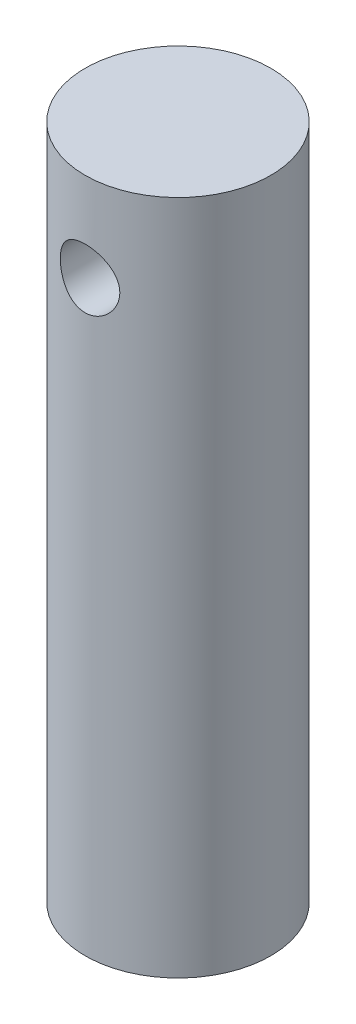
ISO-10303-21;
HEADER;
FILE_DESCRIPTION(('STEP AP214'),'2;1');
FILE_NAME('part.step','',(''),(''),'','','');
FILE_SCHEMA(('AUTOMOTIVE_DESIGN { 1 0 10303 214 1 1 1 1 }'));
ENDSEC;
DATA;
#1=APPLICATION_CONTEXT('core data for automotive mechanical design processes');
#2=APPLICATION_PROTOCOL_DEFINITION('international standard','automotive_design',2000,#1);
#3=PRODUCT_CONTEXT('',#1,'mechanical');
#4=PRODUCT('Part','Part','',(#3));
#5=PRODUCT_RELATED_PRODUCT_CATEGORY('part','',(#4));
#6=PRODUCT_DEFINITION_FORMATION('','',#4);
#7=PRODUCT_DEFINITION_CONTEXT('part definition',#1,'design');
#8=PRODUCT_DEFINITION('design','',#6,#7);
#9=PRODUCT_DEFINITION_SHAPE('','',#8);
#10=(LENGTH_UNIT() NAMED_UNIT(*) SI_UNIT(.MILLI.,.METRE.));
#11=(NAMED_UNIT(*) PLANE_ANGLE_UNIT() SI_UNIT($,.RADIAN.));
#12=(NAMED_UNIT(*) SI_UNIT($,.STERADIAN.) SOLID_ANGLE_UNIT());
#13=UNCERTAINTY_MEASURE_WITH_UNIT(LENGTH_MEASURE(1.E-05),#10,'distance_accuracy_value','');
#14=(GEOMETRIC_REPRESENTATION_CONTEXT(3) GLOBAL_UNCERTAINTY_ASSIGNED_CONTEXT((#13)) GLOBAL_UNIT_ASSIGNED_CONTEXT((#10,
#11,#12)) REPRESENTATION_CONTEXT('',''));
#15=CARTESIAN_POINT('',(0.,0.,0.));
#16=DIRECTION('',(0.,0.,1.));
#17=DIRECTION('',(1.,0.,0.));
#18=AXIS2_PLACEMENT_3D('',#15,#16,#17);
#19=CARTESIAN_POINT('',(20.574,290.957,-19.939));
#20=DIRECTION('',(0.,-1.,0.));
#21=DIRECTION('',(0.,0.,-1.));
#22=AXIS2_PLACEMENT_3D('',#19,#20,#21);
#23=CYLINDRICAL_SURFACE('',#22,9.906);
#24=CARTESIAN_POINT('',(20.574,284.607,-29.845));
#25=CARTESIAN_POINT('',(20.4003900975091,284.606999562888,-29.8449996061915));
#26=CARTESIAN_POINT('',(20.2267746019822,284.59271373406,-29.8403933308697));
#27=CARTESIAN_POINT('',(19.8846347785665,284.536107084769,-29.8224701738279));
#28=CARTESIAN_POINT('',(19.7161113704819,284.493781230604,-29.8091517281183));
#29=CARTESIAN_POINT('',(19.3891383375286,284.382678440052,-29.7752562456891));
#30=CARTESIAN_POINT('',(19.2306731118319,284.313943694529,-29.7546907911152));
#31=CARTESIAN_POINT('',(18.9275180945867,284.152157998881,-29.7084154733764));
#32=CARTESIAN_POINT('',(18.7828306929127,284.059102840629,-29.6827047201083));
#33=CARTESIAN_POINT('',(18.5066631305322,283.848155524504,-29.6279299838278));
#34=CARTESIAN_POINT('',(18.3756902580533,283.729619019658,-29.5987901566408));
#35=CARTESIAN_POINT('',(18.1351014488948,283.472444978284,-29.5408723692128));
#36=CARTESIAN_POINT('',(18.0254897541473,283.33380345879,-29.5120944819057));
#37=CARTESIAN_POINT('',(17.8279296997844,283.035897265666,-29.4573373522228));
#38=CARTESIAN_POINT('',(17.740624744777,282.876187150229,-29.4314512803114));
#39=CARTESIAN_POINT('',(17.5943262770747,282.543387460439,-29.3865541474673));
#40=CARTESIAN_POINT('',(17.535324864277,282.370301635202,-29.3675411684781));
#41=CARTESIAN_POINT('',(17.449182282334,282.021405498296,-29.3393382623613));
#42=CARTESIAN_POINT('',(17.4210964103846,281.845852582549,-29.329857882216));
#43=CARTESIAN_POINT('',(17.3946299992803,281.49228999913,-29.320932404975));
#44=CARTESIAN_POINT('',(17.3962410877471,281.314281038026,-29.3214844794576));
#45=CARTESIAN_POINT('',(17.4283860255288,280.968763995361,-29.3323058482074));
#46=CARTESIAN_POINT('',(17.4577071073125,280.801128149536,-29.3421676684055));
#47=CARTESIAN_POINT('',(17.542468814693,280.473293570519,-29.369833583895));
#48=CARTESIAN_POINT('',(17.5979123480243,280.31309566744,-29.3876385633412));
#49=CARTESIAN_POINT('',(17.7341776934832,280.001846043877,-29.4294885452327));
#50=CARTESIAN_POINT('',(17.8153721512621,279.850970183295,-29.4536242115264));
#51=CARTESIAN_POINT('',(18.0005758026711,279.564592346352,-29.5053758925019));
#52=CARTESIAN_POINT('',(18.1045911782425,279.429094550863,-29.5329928493638));
#53=CARTESIAN_POINT('',(18.3383874139366,279.170478214256,-29.5902181525973));
#54=CARTESIAN_POINT('',(18.4691658543698,279.048266850427,-29.6198584357406));
#55=CARTESIAN_POINT('',(18.7497288111613,278.827283363236,-29.6766243903546));
#56=CARTESIAN_POINT('',(18.8995148840282,278.728513161341,-29.7037498555754));
#57=CARTESIAN_POINT('',(19.2156556946911,278.556557925074,-29.7527406621395));
#58=CARTESIAN_POINT('',(19.3821413753952,278.483599313268,-29.7745589522444));
#59=CARTESIAN_POINT('',(19.725886559119,278.366997824111,-29.8101368137503));
#60=CARTESIAN_POINT('',(19.9031425937042,278.323345563073,-29.8238989644894));
#61=CARTESIAN_POINT('',(20.2557042212796,278.26816452681,-29.8413942383645));
#62=CARTESIAN_POINT('',(20.4307990071384,278.255408529173,-29.8455102845543));
#63=CARTESIAN_POINT('',(20.7806516136552,278.25890848489,-29.8443881106845));
#64=CARTESIAN_POINT('',(20.9554094822125,278.275159954378,-29.8391513363491));
#65=CARTESIAN_POINT('',(21.2948266941627,278.33523341978,-29.8201640449065));
#66=CARTESIAN_POINT('',(21.4596308313205,278.37831648951,-29.8066418593152));
#67=CARTESIAN_POINT('',(21.7796180904854,278.489920177116,-29.7726784506642));
#68=CARTESIAN_POINT('',(21.9348000044281,278.558443981545,-29.7522363608874));
#69=CARTESIAN_POINT('',(22.2354812033595,278.72090432677,-29.7058855888616));
#70=CARTESIAN_POINT('',(22.3806389165075,278.815436526499,-29.6798523778661));
#71=CARTESIAN_POINT('',(22.6534378917215,279.026521354015,-29.6252871712492));
#72=CARTESIAN_POINT('',(22.7810741539488,279.143080244778,-29.5967544661731));
#73=CARTESIAN_POINT('',(23.0207530070436,279.400683190269,-29.5389002188114));
#74=CARTESIAN_POINT('',(23.1319203126039,279.542547325863,-29.5095955845007));
#75=CARTESIAN_POINT('',(23.3289606959753,279.843551670835,-29.4547513522842));
#76=CARTESIAN_POINT('',(23.4148339678688,280.002691747642,-29.4292117254902));
#77=CARTESIAN_POINT('',(23.5583599536811,280.333539233718,-29.3850619207215));
#78=CARTESIAN_POINT('',(23.6161042500276,280.505203738166,-29.3664293028914));
#79=CARTESIAN_POINT('',(23.7016398485219,280.856545356796,-29.3384026591143));
#80=CARTESIAN_POINT('',(23.7294433230972,281.036219183829,-29.3290048788844));
#81=CARTESIAN_POINT('',(23.7534046771126,281.389290263017,-29.3209168710177));
#82=CARTESIAN_POINT('',(23.7510046935671,281.56257962913,-29.3217386621516));
#83=CARTESIAN_POINT('',(23.7181343011121,281.906153212945,-29.3328037727765));
#84=CARTESIAN_POINT('',(23.687665332273,282.07643758436,-29.3430466089237));
#85=CARTESIAN_POINT('',(23.6005088319737,282.406441192232,-29.3714500629734));
#86=CARTESIAN_POINT('',(23.5442544271075,282.566286966696,-29.3894796065412));
#87=CARTESIAN_POINT('',(23.4074683392176,282.874397348048,-29.4313857010331));
#88=CARTESIAN_POINT('',(23.3269315390082,283.022659505545,-29.4552634841953));
#89=CARTESIAN_POINT('',(23.1400216552054,283.309954622222,-29.5073924945417));
#90=CARTESIAN_POINT('',(23.0327274056325,283.448362996902,-29.5357825500603));
#91=CARTESIAN_POINT('',(22.7969450135381,283.70567702225,-29.5931209962115));
#92=CARTESIAN_POINT('',(22.6684510831818,283.824577329191,-29.6220695374079));
#93=CARTESIAN_POINT('',(22.3885111653527,284.043675934385,-29.6784786976015));
#94=CARTESIAN_POINT('',(22.2364194020823,284.143074282696,-29.705851812889));
#95=CARTESIAN_POINT('',(21.9168117042693,284.314769298846,-29.7548939099958));
#96=CARTESIAN_POINT('',(21.7493010735514,284.387075242929,-29.776564843443));
#97=CARTESIAN_POINT('',(21.4156289154909,284.498108442957,-29.8105062287362));
#98=CARTESIAN_POINT('',(21.2501828955443,284.538820324816,-29.8233253822498));
#99=CARTESIAN_POINT('',(20.9144923067557,284.593263237149,-29.8405715028082));
#100=CARTESIAN_POINT('',(20.7442488426637,284.60700042865,-29.8450003861844));
#101=CARTESIAN_POINT('',(20.574,284.607,-29.845));
#102=B_SPLINE_CURVE_WITH_KNOTS('',3,(#24,#25,#26,#27,#28,#29,#30,#31,#32,#33,#34,#35,#36,#37,
#38,#39,#40,#41,#42,#43,#44,#45,#46,#47,#48,#49,#50,#51,#52,#53,#54,#55,#56,#57,#58,#59,#60,#61,
#62,#63,#64,#65,#66,#67,#68,#69,#70,#71,#72,#73,#74,#75,#76,#77,#78,#79,#80,#81,#82,#83,#84,#85,
#86,#87,#88,#89,#90,#91,#92,#93,#94,#95,#96,#97,#98,#99,#100,#101),.UNSPECIFIED.,.T.,.F.,(4,2,2,
2,2,2,2,2,2,2,2,2,2,2,2,2,2,2,2,2,2,2,2,2,2,2,2,2,2,2,2,2,2,2,2,2,2,2,4),(0.,0.520203653190159,
1.04050071782689,1.55996998879536,2.07952920238256,2.61421803209669,3.14901293309813,
3.69783084299902,4.24649547723637,4.77788401275632,5.309122737732,5.81813774594538,
6.32720942687722,6.84401266954643,7.36095608188885,7.90272878350447,8.44454587879508,
8.99100443008418,9.53728792564177,10.0614885570786,10.5856081665447,11.0958958548675,
11.6062474803186,12.1294314627599,12.6527644295539,13.1979818527922,13.7431950924381,
14.2866211591328,14.8298262127012,15.3471971329632,15.8645415111503,16.373497501837,
16.8825608231595,17.4124232772658,17.9424306319825,18.4909828852277,19.0393471461224,
19.5495962947256,20.0597288887445),.UNSPECIFIED.);
#103=CARTESIAN_POINT('',(20.574,284.607,-29.845));
#104=VERTEX_POINT('',#103);
#105=EDGE_CURVE('E45',#104,#104,#102,.T.);
#106=ORIENTED_EDGE('',*,*,#105,.T.);
#107=EDGE_LOOP('',(#106));
#108=FACE_BOUND('',#107,.T.);
#109=CARTESIAN_POINT('',(23.749,281.432,-10.5555991772705));
#110=CARTESIAN_POINT('',(23.7489995390351,281.258648845424,-10.555598669891));
#111=CARTESIAN_POINT('',(23.73475472324,281.085292093388,-10.5507428403606));
#112=CARTESIAN_POINT('',(23.6783257570464,280.743687818861,-10.531935652275));
#113=CARTESIAN_POINT('',(23.6361351975167,280.575441477662,-10.5179822072666));
#114=CARTESIAN_POINT('',(23.5254275060581,280.24905768367,-10.4827190522964));
#115=CARTESIAN_POINT('',(23.456958833973,280.090902244538,-10.461422890448));
#116=CARTESIAN_POINT('',(23.2958016799056,279.78827622172,-10.4138929944622));
#117=CARTESIAN_POINT('',(23.2031085050567,279.643808297031,-10.3876583038893));
#118=CARTESIAN_POINT('',(22.9925447882256,279.367435871302,-10.3321436934421));
#119=CARTESIAN_POINT('',(22.8739482742391,279.236098733427,-10.3027921228796));
#120=CARTESIAN_POINT('',(22.616496293565,278.99479483814,-10.2449590642021));
#121=CARTESIAN_POINT('',(22.4776378477726,278.884831228824,-10.21647770478));
#122=CARTESIAN_POINT('',(22.1794994338713,278.686865608948,-10.162770781909));
#123=CARTESIAN_POINT('',(22.0198104845676,278.599451735604,-10.1376393759217));
#124=CARTESIAN_POINT('',(21.687053441495,278.452946469813,-10.094303527544));
#125=CARTESIAN_POINT('',(21.5139886778021,278.393848054089,-10.0760973676682));
#126=CARTESIAN_POINT('',(21.1653363559693,278.307556830947,-10.0491706408477));
#127=CARTESIAN_POINT('',(20.9900116534782,278.279393464855,-10.0401621911904));
#128=CARTESIAN_POINT('',(20.6369093181982,278.252692550356,-10.0316271990831));
#129=CARTESIAN_POINT('',(20.4591322812483,278.254147927961,-10.0320983925639));
#130=CARTESIAN_POINT('',(20.113017246645,278.286013338169,-10.0422711662201));
#131=CARTESIAN_POINT('',(19.9445708572342,278.315370479982,-10.0516370882707));
#132=CARTESIAN_POINT('',(19.6151357663183,278.40047336135,-10.0781308856556));
#133=CARTESIAN_POINT('',(19.4541475599441,278.456220850147,-10.0952592755098));
#134=CARTESIAN_POINT('',(19.1418175974258,278.593174871574,-10.1357952456068));
#135=CARTESIAN_POINT('',(18.9906229499398,278.674693346282,-10.1592792264352));
#136=CARTESIAN_POINT('',(18.7037374951982,278.860622591593,-10.2100632635124));
#137=CARTESIAN_POINT('',(18.5680507753764,278.965039376449,-10.2373643216344));
#138=CARTESIAN_POINT('',(18.3097596090472,279.199169584741,-10.2942960196121));
#139=CARTESIAN_POINT('',(18.1879866322157,279.329789491973,-10.3239763241294));
#140=CARTESIAN_POINT('',(17.967818041401,279.609865234723,-10.3813000865392));
#141=CARTESIAN_POINT('',(17.8694254872229,279.759323531717,-10.4089432775078));
#142=CARTESIAN_POINT('',(17.6977751670265,280.075289872861,-10.4593217241486));
#143=CARTESIAN_POINT('',(17.6248414173911,280.241985004097,-10.4819924356187));
#144=CARTESIAN_POINT('',(17.5083486253,280.586195456073,-10.51910619941));
#145=CARTESIAN_POINT('',(17.4647783736975,280.763706619679,-10.5335523910111));
#146=CARTESIAN_POINT('',(17.4098868374428,281.116510345579,-10.5518795117724));
#147=CARTESIAN_POINT('',(17.3972862425618,281.291582198877,-10.5561792587354));
#148=CARTESIAN_POINT('',(17.4010879812931,281.641356226441,-10.5548924763253));
#149=CARTESIAN_POINT('',(17.4174855442112,281.816058456783,-10.5493075731465));
#150=CARTESIAN_POINT('',(17.4776723805921,282.154510097642,-10.5292958124389));
#151=CARTESIAN_POINT('',(17.5205988996103,282.318431146569,-10.5151477282929));
#152=CARTESIAN_POINT('',(17.6316037877074,282.636720351873,-10.4799033861806));
#153=CARTESIAN_POINT('',(17.699686397315,282.791086892536,-10.4588059568377));
#154=CARTESIAN_POINT('',(17.8613868420137,283.090987774903,-10.4112589135614));
#155=CARTESIAN_POINT('',(17.9557063087524,283.236120873992,-10.3846683221826));
#156=CARTESIAN_POINT('',(18.1663931271625,283.508964480416,-10.3294159111981));
#157=CARTESIAN_POINT('',(18.2827665005126,283.6366702129,-10.3007535272279));
#158=CARTESIAN_POINT('',(18.5403356898319,283.876826024731,-10.2430634746458));
#159=CARTESIAN_POINT('',(18.6823974333562,283.988359361769,-10.2140750819163));
#160=CARTESIAN_POINT('',(18.983926894148,284.186048768724,-10.160251455954));
#161=CARTESIAN_POINT('',(19.1433938720024,284.272205916104,-10.1354160464065));
#162=CARTESIAN_POINT('',(19.4742872951391,284.415881003148,-10.0928299482725));
#163=CARTESIAN_POINT('',(19.6456198316103,284.473599782449,-10.075029757226));
#164=CARTESIAN_POINT('',(19.9962357645985,284.559194998656,-10.0483031214846));
#165=CARTESIAN_POINT('',(20.1755165096599,284.587081310562,-10.0393737404864));
#166=CARTESIAN_POINT('',(20.5285218035825,284.611384680092,-10.0315996727426));
#167=CARTESIAN_POINT('',(20.7021471265461,284.609122716187,-10.0323316492719));
#168=CARTESIAN_POINT('',(21.0464304731927,284.576412425482,-10.0427733465139));
#169=CARTESIAN_POINT('',(21.2170887068393,284.545966101465,-10.0524824293127));
#170=CARTESIAN_POINT('',(21.5482771224043,284.458606592941,-10.0796451876183));
#171=CARTESIAN_POINT('',(21.7089142466594,284.40206281633,-10.0969906178987));
#172=CARTESIAN_POINT('',(22.0184936404195,284.264449997697,-10.1376390255194));
#173=CARTESIAN_POINT('',(22.1674338514434,284.183376650968,-10.1609430484251));
#174=CARTESIAN_POINT('',(22.4550862541752,283.995719324097,-10.2121067939125));
#175=CARTESIAN_POINT('',(22.593255678412,283.888339546976,-10.2400977486107));
#176=CARTESIAN_POINT('',(22.8500503306485,283.652501940289,-10.2971243376308));
#177=CARTESIAN_POINT('',(22.9686695418159,283.524037645875,-10.326160290227));
#178=CARTESIAN_POINT('',(23.18724313995,283.244235401769,-10.3832150406216));
#179=CARTESIAN_POINT('',(23.2863888018085,283.092249046372,-10.4111615192087));
#180=CARTESIAN_POINT('',(23.457635920857,282.772918613244,-10.4615799632596));
#181=CARTESIAN_POINT('',(23.5297468969277,282.605579966917,-10.4840538546361));
#182=CARTESIAN_POINT('',(23.6404443589439,282.2723403432,-10.5193978814111));
#183=CARTESIAN_POINT('',(23.6810280300338,282.107162274879,-10.5328312089641));
#184=CARTESIAN_POINT('',(23.7353023016782,281.771990355,-10.5509308750857));
#185=CARTESIAN_POINT('',(23.7490004520481,281.601997869,-10.5555996748354));
#186=CARTESIAN_POINT('',(23.749,281.432,-10.5555991772705));
#187=B_SPLINE_CURVE_WITH_KNOTS('',3,(#109,#110,#111,#112,#113,#114,#115,#116,#117,#118,#119,
#120,#121,#122,#123,#124,#125,#126,#127,#128,#129,#130,#131,#132,#133,#134,#135,#136,#137,#138,
#139,#140,#141,#142,#143,#144,#145,#146,#147,#148,#149,#150,#151,#152,#153,#154,#155,#156,#157,
#158,#159,#160,#161,#162,#163,#164,#165,#166,#167,#168,#169,#170,#171,#172,#173,#174,#175,#176,
#177,#178,#179,#180,#181,#182,#183,#184,#185,#186),.UNSPECIFIED.,.T.,.F.,(4,2,2,2,2,2,2,2,2,2,2,
2,2,2,2,2,2,2,2,2,2,2,2,2,2,2,2,2,2,2,2,2,2,2,2,2,2,2,4),(0.,0.519424913269979,1.03896899372477,
1.55755954366802,2.07625063159032,2.61195145698113,3.14773112578966,3.69632464246908,
4.24478201718657,4.77549171645943,5.30607466525917,5.81739893053468,6.32875709290453,
6.84655855087936,7.36449617288678,7.90508126396085,8.4457370627056,8.99304239171278,
9.54013867525679,10.0642241589064,10.5882234295295,11.0960183198062,11.6038988474713,
12.1269412246057,12.6501266214326,13.1962977107937,13.742445606616,14.2846791015578,
14.8267330533656,15.3451174273333,15.863464967704,16.3746903114133,16.8860054224304,
17.4152743224352,17.94470580888,18.4928662860357,19.0408335748635,19.5503538906459,
20.0597311057995),.UNSPECIFIED.);
#188=CARTESIAN_POINT('',(23.749,281.432,-10.5555991772705));
#189=VERTEX_POINT('',#188);
#190=EDGE_CURVE('E59',#189,#189,#187,.T.);
#191=ORIENTED_EDGE('',*,*,#190,.T.);
#192=EDGE_LOOP('',(#191));
#193=FACE_BOUND('',#192,.T.);
#194=CARTESIAN_POINT('',(20.574,290.957,-19.939));
#195=DIRECTION('',(0.,1.,0.));
#196=DIRECTION('',(0.,0.,1.));
#197=AXIS2_PLACEMENT_3D('',#194,#195,#196);
#198=CIRCLE('',#197,9.906);
#199=CARTESIAN_POINT('',(20.574,290.957,-10.033));
#200=VERTEX_POINT('',#199);
#201=EDGE_CURVE('E10',#200,#200,#198,.T.);
#202=ORIENTED_EDGE('',*,*,#201,.F.);
#203=EDGE_LOOP('',(#202));
#204=FACE_BOUND('',#203,.T.);
#205=CARTESIAN_POINT('',(20.574,218.821,-19.939));
#206=DIRECTION('',(0.,-1.,0.));
#207=DIRECTION('',(0.,0.,-1.));
#208=AXIS2_PLACEMENT_3D('',#205,#206,#207);
#209=CIRCLE('',#208,9.90600000000001);
#210=CARTESIAN_POINT('',(20.574,218.821,-29.845));
#211=VERTEX_POINT('',#210);
#212=EDGE_CURVE('E61',#211,#211,#209,.T.);
#213=ORIENTED_EDGE('',*,*,#212,.F.);
#214=EDGE_LOOP('',(#213));
#215=FACE_BOUND('',#214,.T.);
#216=ADVANCED_FACE('F41',(#108,#193,#204,#215),#23,.T.);
#217=CARTESIAN_POINT('',(20.574,290.957,-19.939));
#218=DIRECTION('',(0.,1.,0.));
#219=DIRECTION('',(0.,0.,1.));
#220=AXIS2_PLACEMENT_3D('',#217,#218,#219);
#221=PLANE('',#220);
#222=ORIENTED_EDGE('',*,*,#201,.T.);
#223=EDGE_LOOP('',(#222));
#224=FACE_BOUND('',#223,.T.);
#225=ADVANCED_FACE('F72',(#224),#221,.T.);
#226=CARTESIAN_POINT('',(20.574,281.432,-60.687154312765));
#227=DIRECTION('',(0.,0.,1.));
#228=DIRECTION('',(1.,0.,0.));
#229=AXIS2_PLACEMENT_3D('',#226,#227,#228);
#230=CYLINDRICAL_SURFACE('',#229,3.175);
#231=ORIENTED_EDGE('',*,*,#190,.F.);
#232=EDGE_LOOP('',(#231));
#233=FACE_BOUND('',#232,.T.);
#234=ORIENTED_EDGE('',*,*,#105,.F.);
#235=EDGE_LOOP('',(#234));
#236=FACE_BOUND('',#235,.T.);
#237=ADVANCED_FACE('F67',(#233,#236),#230,.F.);
#238=CARTESIAN_POINT('',(20.574,218.821,-19.939));
#239=DIRECTION('',(0.,-1.,0.));
#240=DIRECTION('',(0.,0.,-1.));
#241=AXIS2_PLACEMENT_3D('',#238,#239,#240);
#242=PLANE('',#241);
#243=ORIENTED_EDGE('',*,*,#212,.T.);
#244=EDGE_LOOP('',(#243));
#245=FACE_BOUND('',#244,.T.);
#246=ADVANCED_FACE('F71',(#245),#242,.T.);
#247=CLOSED_SHELL('',(#216,#225,#237,#246));
#248=MANIFOLD_SOLID_BREP('B2',#247);
#249=ADVANCED_BREP_SHAPE_REPRESENTATION('',(#18,#248),#14);
#250=SHAPE_DEFINITION_REPRESENTATION(#9,#249);
ENDSEC;
END-ISO-10303-21;
